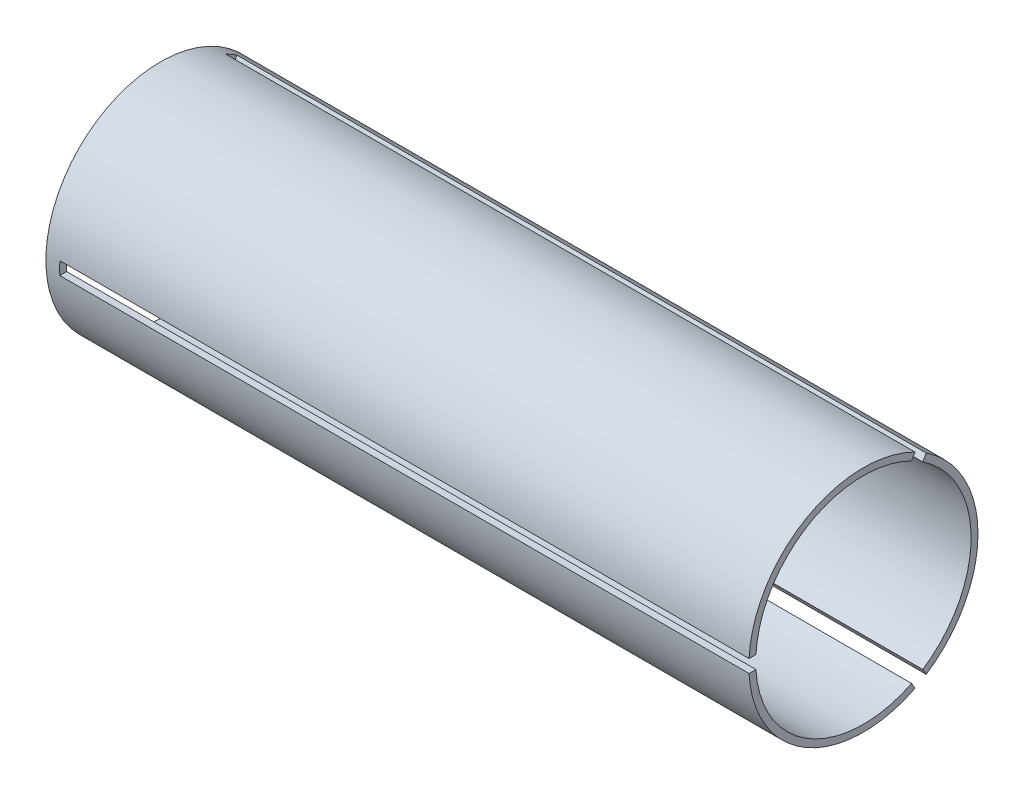
ISO-10303-21;
HEADER;
FILE_DESCRIPTION(('STEP AP214'),'2;1');
FILE_NAME('part.step','',(''),(''),'','','');
FILE_SCHEMA(('AUTOMOTIVE_DESIGN { 1 0 10303 214 1 1 1 1 }'));
ENDSEC;
DATA;
#1=APPLICATION_CONTEXT('core data for automotive mechanical design processes');
#2=APPLICATION_PROTOCOL_DEFINITION('international standard','automotive_design',2000,#1);
#3=PRODUCT_CONTEXT('',#1,'mechanical');
#4=PRODUCT('Part','Part','',(#3));
#5=PRODUCT_RELATED_PRODUCT_CATEGORY('part','',(#4));
#6=PRODUCT_DEFINITION_FORMATION('','',#4);
#7=PRODUCT_DEFINITION_CONTEXT('part definition',#1,'design');
#8=PRODUCT_DEFINITION('design','',#6,#7);
#9=PRODUCT_DEFINITION_SHAPE('','',#8);
#10=(LENGTH_UNIT() NAMED_UNIT(*) SI_UNIT(.MILLI.,.METRE.));
#11=(NAMED_UNIT(*) PLANE_ANGLE_UNIT() SI_UNIT($,.RADIAN.));
#12=(NAMED_UNIT(*) SI_UNIT($,.STERADIAN.) SOLID_ANGLE_UNIT());
#13=UNCERTAINTY_MEASURE_WITH_UNIT(LENGTH_MEASURE(1.E-05),#10,'distance_accuracy_value','');
#14=(GEOMETRIC_REPRESENTATION_CONTEXT(3) GLOBAL_UNCERTAINTY_ASSIGNED_CONTEXT((#13)) GLOBAL_UNIT_ASSIGNED_CONTEXT((#10,
#11,#12)) REPRESENTATION_CONTEXT('',''));
#15=CARTESIAN_POINT('',(0.,0.,0.));
#16=DIRECTION('',(0.,0.,1.));
#17=DIRECTION('',(1.,0.,0.));
#18=AXIS2_PLACEMENT_3D('',#15,#16,#17);
#19=CARTESIAN_POINT('',(259.08,0.,0.));
#20=DIRECTION('',(1.,0.,0.));
#21=DIRECTION('',(0.,0.,-1.));
#22=AXIS2_PLACEMENT_3D('',#19,#20,#21);
#23=PLANE('',#22);
#24=CARTESIAN_POINT('',(259.08,0.,0.));
#25=DIRECTION('',(1.,0.,0.));
#26=DIRECTION('',(0.,0.,-1.));
#27=AXIS2_PLACEMENT_3D('',#24,#25,#26);
#28=CIRCLE('',#27,39.6875);
#29=CARTESIAN_POINT('',(259.08,-33.117835742441,-21.870222037892));
#30=VERTEX_POINT('',#29);
#31=CARTESIAN_POINT('',(259.08,33.1178357424414,-21.8702220378915));
#32=VERTEX_POINT('',#31);
#33=EDGE_CURVE('E261',#30,#32,#28,.T.);
#34=ORIENTED_EDGE('',*,*,#33,.F.);
#35=DIRECTION('',(0.,0.866025403784436,0.500000000000004));
#36=VECTOR('',#35,1.);
#37=CARTESIAN_POINT('',(259.08,-48.7650438691536,-30.9041418619156));
#38=LINE('',#37,#36);
#39=CARTESIAN_POINT('',(259.08,-35.3212710547876,-23.1423760086172));
#40=VERTEX_POINT('',#39);
#41=EDGE_CURVE('E222',#40,#30,#38,.T.);
#42=ORIENTED_EDGE('',*,*,#41,.F.);
#43=CARTESIAN_POINT('',(259.08,0.,0.));
#44=DIRECTION('',(1.,0.,0.));
#45=DIRECTION('',(0.,0.,-1.));
#46=AXIS2_PLACEMENT_3D('',#43,#44,#45);
#47=CIRCLE('',#46,42.2275);
#48=CARTESIAN_POINT('',(259.08,35.321271054788,-23.1423760086167));
#49=VERTEX_POINT('',#48);
#50=EDGE_CURVE('E160',#40,#49,#47,.T.);
#51=ORIENTED_EDGE('',*,*,#50,.T.);
#52=DIRECTION('',(0.,-0.866025403784443,0.499999999999992));
#53=VECTOR('',#52,1.);
#54=CARTESIAN_POINT('',(259.08,48.7650438691539,-30.9041418619149));
#55=LINE('',#54,#53);
#56=EDGE_CURVE('E153',#49,#32,#55,.T.);
#57=ORIENTED_EDGE('',*,*,#56,.T.);
#58=EDGE_LOOP('',(#34,#42,#51,#57));
#59=FACE_BOUND('',#58,.T.);
#60=ADVANCED_FACE('F45',(#59),#23,.T.);
#61=CARTESIAN_POINT('',(259.08,-2.38125,42.1603060317107));
#62=VERTEX_POINT('',#61);
#63=CARTESIAN_POINT('',(259.08,-37.7025210547877,-19.0179300230938));
#64=VERTEX_POINT('',#63);
#65=EDGE_CURVE('E163',#62,#64,#47,.T.);
#66=ORIENTED_EDGE('',*,*,#65,.T.);
#67=DIRECTION('',(0.,0.866025403784436,0.500000000000004));
#68=VECTOR('',#67,1.);
#69=CARTESIAN_POINT('',(259.08,-51.1462938691536,-26.7796958763923));
#70=LINE('',#69,#68);
#71=CARTESIAN_POINT('',(259.08,-35.4990857424411,-17.7457760523686));
#72=VERTEX_POINT('',#71);
#73=EDGE_CURVE('E284',#64,#72,#70,.T.);
#74=ORIENTED_EDGE('',*,*,#73,.T.);
#75=CARTESIAN_POINT('',(259.08,-2.38125,39.6159980902602));
#76=VERTEX_POINT('',#75);
#77=EDGE_CURVE('E168',#76,#72,#28,.T.);
#78=ORIENTED_EDGE('',*,*,#77,.F.);
#79=DIRECTION('',(0.,0.,-1.));
#80=VECTOR('',#79,1.);
#81=CARTESIAN_POINT('',(259.08,-2.38125,42.2275));
#82=LINE('',#81,#80);
#83=EDGE_CURVE('E240',#62,#76,#82,.T.);
#84=ORIENTED_EDGE('',*,*,#83,.F.);
#85=EDGE_LOOP('',(#66,#74,#78,#84));
#86=FACE_BOUND('',#85,.T.);
#87=ADVANCED_FACE('F305',(#86),#23,.T.);
#88=CARTESIAN_POINT('',(259.08,35.4990857424413,-17.7457760523681));
#89=VERTEX_POINT('',#88);
#90=CARTESIAN_POINT('',(259.08,2.38125,39.6159980902602));
#91=VERTEX_POINT('',#90);
#92=EDGE_CURVE('E151',#89,#91,#28,.T.);
#93=ORIENTED_EDGE('',*,*,#92,.F.);
#94=DIRECTION('',(0.,-0.866025403784443,0.499999999999992));
#95=VECTOR('',#94,1.);
#96=CARTESIAN_POINT('',(259.08,51.1462938691538,-26.7796958763914));
#97=LINE('',#96,#95);
#98=CARTESIAN_POINT('',(259.08,37.7025210547879,-19.0179300230933));
#99=VERTEX_POINT('',#98);
#100=EDGE_CURVE('E69',#99,#89,#97,.T.);
#101=ORIENTED_EDGE('',*,*,#100,.F.);
#102=CARTESIAN_POINT('',(259.08,2.38125,42.1603060317107));
#103=VERTEX_POINT('',#102);
#104=EDGE_CURVE('E149',#99,#103,#47,.T.);
#105=ORIENTED_EDGE('',*,*,#104,.T.);
#106=DIRECTION('',(0.,0.,-1.));
#107=VECTOR('',#106,1.);
#108=CARTESIAN_POINT('',(259.08,2.38125,42.2275));
#109=LINE('',#108,#107);
#110=EDGE_CURVE('E237',#103,#91,#109,.T.);
#111=ORIENTED_EDGE('',*,*,#110,.T.);
#112=EDGE_LOOP('',(#93,#101,#105,#111));
#113=FACE_BOUND('',#112,.T.);
#114=ADVANCED_FACE('F147',(#113),#23,.T.);
#115=CARTESIAN_POINT('',(259.08,0.,0.));
#116=DIRECTION('',(-1.,0.,0.));
#117=DIRECTION('',(0.,0.,1.));
#118=AXIS2_PLACEMENT_3D('',#115,#116,#117);
#119=CYLINDRICAL_SURFACE('',#118,42.2275);
#120=CARTESIAN_POINT('',(0.,0.,0.));
#121=DIRECTION('',(1.,0.,0.));
#122=DIRECTION('',(0.,0.,-1.));
#123=AXIS2_PLACEMENT_3D('',#120,#121,#122);
#124=CIRCLE('',#123,42.2275);
#125=CARTESIAN_POINT('',(0.,0.,-42.2275));
#126=VERTEX_POINT('',#125);
#127=EDGE_CURVE('E161',#126,#126,#124,.T.);
#128=ORIENTED_EDGE('',*,*,#127,.T.);
#129=EDGE_LOOP('',(#128));
#130=FACE_BOUND('',#129,.T.);
#131=DIRECTION('',(-1.,0.,0.));
#132=VECTOR('',#131,1.);
#133=CARTESIAN_POINT('',(259.08,-35.3212710547876,-23.1423760086172));
#134=LINE('',#133,#132);
#135=CARTESIAN_POINT('',(5.07999999999997,-35.3212710547876,-23.1423760086172));
#136=VERTEX_POINT('',#135);
#137=EDGE_CURVE('E234',#136,#40,#134,.F.);
#138=ORIENTED_EDGE('',*,*,#137,.F.);
#139=CARTESIAN_POINT('',(5.07999999999997,0.,0.));
#140=DIRECTION('',(1.,0.,0.));
#141=DIRECTION('',(0.,0.,-1.));
#142=AXIS2_PLACEMENT_3D('',#139,#140,#141);
#143=CIRCLE('',#142,42.2275);
#144=CARTESIAN_POINT('',(5.07999999999997,-37.7025210547876,-19.0179300230939));
#145=VERTEX_POINT('',#144);
#146=EDGE_CURVE('E228',#145,#136,#143,.T.);
#147=ORIENTED_EDGE('',*,*,#146,.F.);
#148=DIRECTION('',(-1.,0.,0.));
#149=VECTOR('',#148,1.);
#150=CARTESIAN_POINT('',(259.08,-37.7025210547877,-19.0179300230938));
#151=LINE('',#150,#149);
#152=EDGE_CURVE('E218',#64,#145,#151,.T.);
#153=ORIENTED_EDGE('',*,*,#152,.F.);
#154=ORIENTED_EDGE('',*,*,#65,.F.);
#155=DIRECTION('',(-1.,0.,0.));
#156=VECTOR('',#155,1.);
#157=CARTESIAN_POINT('',(259.08,-2.38125,42.1603060317107));
#158=LINE('',#157,#156);
#159=CARTESIAN_POINT('',(5.07999999999997,-2.38125000000003,42.1603060317107));
#160=VERTEX_POINT('',#159);
#161=EDGE_CURVE('E251',#160,#62,#158,.F.);
#162=ORIENTED_EDGE('',*,*,#161,.F.);
#163=CARTESIAN_POINT('',(5.07999999999997,0.,0.));
#164=DIRECTION('',(1.,0.,0.));
#165=DIRECTION('',(0.,0.,-1.));
#166=AXIS2_PLACEMENT_3D('',#163,#164,#165);
#167=CIRCLE('',#166,42.2275);
#168=CARTESIAN_POINT('',(5.07999999999997,2.38124999999997,42.1603060317107));
#169=VERTEX_POINT('',#168);
#170=EDGE_CURVE('E254',#169,#160,#167,.T.);
#171=ORIENTED_EDGE('',*,*,#170,.F.);
#172=DIRECTION('',(-1.,0.,0.));
#173=VECTOR('',#172,1.);
#174=CARTESIAN_POINT('',(259.08,2.38125,42.1603060317107));
#175=LINE('',#174,#173);
#176=EDGE_CURVE('E158',#103,#169,#175,.T.);
#177=ORIENTED_EDGE('',*,*,#176,.F.);
#178=ORIENTED_EDGE('',*,*,#104,.F.);
#179=DIRECTION('',(-1.,0.,0.));
#180=VECTOR('',#179,1.);
#181=CARTESIAN_POINT('',(259.08,37.7025210547879,-19.0179300230933));
#182=LINE('',#181,#180);
#183=CARTESIAN_POINT('',(5.07999999999997,37.7025210547879,-19.0179300230933));
#184=VERTEX_POINT('',#183);
#185=EDGE_CURVE('E134',#184,#99,#182,.F.);
#186=ORIENTED_EDGE('',*,*,#185,.F.);
#187=CARTESIAN_POINT('',(5.07999999999997,35.321271054788,-23.1423760086167));
#188=VERTEX_POINT('',#187);
#189=EDGE_CURVE('E231',#188,#184,#143,.T.);
#190=ORIENTED_EDGE('',*,*,#189,.F.);
#191=DIRECTION('',(-1.,0.,0.));
#192=VECTOR('',#191,1.);
#193=CARTESIAN_POINT('',(259.08,35.321271054788,-23.1423760086167));
#194=LINE('',#193,#192);
#195=EDGE_CURVE('E142',#49,#188,#194,.T.);
#196=ORIENTED_EDGE('',*,*,#195,.F.);
#197=ORIENTED_EDGE('',*,*,#50,.F.);
#198=EDGE_LOOP('',(#138,#147,#153,#154,#162,#171,#177,#178,#186,#190,#196,#197));
#199=FACE_BOUND('',#198,.T.);
#200=ADVANCED_FACE('F47',(#130,#199),#119,.T.);
#201=CARTESIAN_POINT('',(259.08,0.,0.));
#202=DIRECTION('',(-1.,0.,0.));
#203=DIRECTION('',(0.,0.,1.));
#204=AXIS2_PLACEMENT_3D('',#201,#202,#203);
#205=CYLINDRICAL_SURFACE('',#204,39.6875);
#206=CARTESIAN_POINT('',(0.,0.,0.));
#207=DIRECTION('',(1.,0.,0.));
#208=DIRECTION('',(0.,0.,-1.));
#209=AXIS2_PLACEMENT_3D('',#206,#207,#208);
#210=CIRCLE('',#209,39.6875);
#211=CARTESIAN_POINT('',(0.,0.,-39.6875));
#212=VERTEX_POINT('',#211);
#213=EDGE_CURVE('E259',#212,#212,#210,.T.);
#214=ORIENTED_EDGE('',*,*,#213,.F.);
#215=EDGE_LOOP('',(#214));
#216=FACE_BOUND('',#215,.T.);
#217=CARTESIAN_POINT('',(5.07999999999997,0.,0.));
#218=DIRECTION('',(1.,0.,0.));
#219=DIRECTION('',(0.,0.,-1.));
#220=AXIS2_PLACEMENT_3D('',#217,#218,#219);
#221=CIRCLE('',#220,39.6875);
#222=CARTESIAN_POINT('',(5.07999999999997,-35.499085742441,-17.7457760523686));
#223=VERTEX_POINT('',#222);
#224=CARTESIAN_POINT('',(5.07999999999997,-33.117835742441,-21.870222037892));
#225=VERTEX_POINT('',#224);
#226=EDGE_CURVE('E201',#223,#225,#221,.T.);
#227=ORIENTED_EDGE('',*,*,#226,.T.);
#228=DIRECTION('',(-1.,0.,0.));
#229=VECTOR('',#228,1.);
#230=CARTESIAN_POINT('',(259.08,-33.117835742441,-21.870222037892));
#231=LINE('',#230,#229);
#232=EDGE_CURVE('E11',#225,#30,#231,.F.);
#233=ORIENTED_EDGE('',*,*,#232,.T.);
#234=ORIENTED_EDGE('',*,*,#33,.T.);
#235=DIRECTION('',(-1.,0.,0.));
#236=VECTOR('',#235,1.);
#237=CARTESIAN_POINT('',(259.08,33.1178357424414,-21.8702220378915));
#238=LINE('',#237,#236);
#239=CARTESIAN_POINT('',(5.07999999999997,33.1178357424414,-21.8702220378915));
#240=VERTEX_POINT('',#239);
#241=EDGE_CURVE('E200',#32,#240,#238,.T.);
#242=ORIENTED_EDGE('',*,*,#241,.T.);
#243=CARTESIAN_POINT('',(5.07999999999997,35.4990857424413,-17.745776052368));
#244=VERTEX_POINT('',#243);
#245=EDGE_CURVE('E196',#240,#244,#221,.T.);
#246=ORIENTED_EDGE('',*,*,#245,.T.);
#247=DIRECTION('',(-1.,0.,0.));
#248=VECTOR('',#247,1.);
#249=CARTESIAN_POINT('',(259.08,35.4990857424413,-17.7457760523681));
#250=LINE('',#249,#248);
#251=EDGE_CURVE('E193',#244,#89,#250,.F.);
#252=ORIENTED_EDGE('',*,*,#251,.T.);
#253=ORIENTED_EDGE('',*,*,#92,.T.);
#254=DIRECTION('',(-1.,0.,0.));
#255=VECTOR('',#254,1.);
#256=CARTESIAN_POINT('',(259.08,2.38125,39.6159980902602));
#257=LINE('',#256,#255);
#258=CARTESIAN_POINT('',(5.07999999999997,2.38124999999997,39.6159980902602));
#259=VERTEX_POINT('',#258);
#260=EDGE_CURVE('E187',#91,#259,#257,.T.);
#261=ORIENTED_EDGE('',*,*,#260,.T.);
#262=CARTESIAN_POINT('',(5.07999999999997,0.,0.));
#263=DIRECTION('',(1.,0.,0.));
#264=DIRECTION('',(0.,0.,-1.));
#265=AXIS2_PLACEMENT_3D('',#262,#263,#264);
#266=CIRCLE('',#265,39.6875);
#267=CARTESIAN_POINT('',(5.07999999999997,-2.38125000000003,39.6159980902602));
#268=VERTEX_POINT('',#267);
#269=EDGE_CURVE('E180',#259,#268,#266,.T.);
#270=ORIENTED_EDGE('',*,*,#269,.T.);
#271=DIRECTION('',(-1.,0.,0.));
#272=VECTOR('',#271,1.);
#273=CARTESIAN_POINT('',(259.08,-2.38125,39.6159980902602));
#274=LINE('',#273,#272);
#275=EDGE_CURVE('E173',#268,#76,#274,.F.);
#276=ORIENTED_EDGE('',*,*,#275,.T.);
#277=ORIENTED_EDGE('',*,*,#77,.T.);
#278=DIRECTION('',(-1.,0.,0.));
#279=VECTOR('',#278,1.);
#280=CARTESIAN_POINT('',(259.08,-35.4990857424411,-17.7457760523686));
#281=LINE('',#280,#279);
#282=EDGE_CURVE('E54',#72,#223,#281,.T.);
#283=ORIENTED_EDGE('',*,*,#282,.T.);
#284=EDGE_LOOP('',(#227,#233,#234,#242,#246,#252,#253,#261,#270,#276,#277,#283));
#285=FACE_BOUND('',#284,.T.);
#286=ADVANCED_FACE('F208',(#216,#285),#205,.F.);
#287=CARTESIAN_POINT('',(0.,0.,0.));
#288=DIRECTION('',(1.,0.,0.));
#289=DIRECTION('',(0.,0.,-1.));
#290=AXIS2_PLACEMENT_3D('',#287,#288,#289);
#291=PLANE('',#290);
#292=ORIENTED_EDGE('',*,*,#127,.F.);
#293=EDGE_LOOP('',(#292));
#294=FACE_BOUND('',#293,.T.);
#295=ORIENTED_EDGE('',*,*,#213,.T.);
#296=EDGE_LOOP('',(#295));
#297=FACE_BOUND('',#296,.T.);
#298=ADVANCED_FACE('F320',(#294,#297),#291,.F.);
#299=CARTESIAN_POINT('',(5.07999999999997,2.38124999999997,42.2275));
#300=DIRECTION('',(0.,-1.,0.));
#301=DIRECTION('',(1.,0.,0.));
#302=AXIS2_PLACEMENT_3D('',#299,#300,#301);
#303=PLANE('',#302);
#304=ORIENTED_EDGE('',*,*,#176,.T.);
#305=DIRECTION('',(0.,0.,-1.));
#306=VECTOR('',#305,1.);
#307=CARTESIAN_POINT('',(5.07999999999997,2.38124999999997,42.2275));
#308=LINE('',#307,#306);
#309=EDGE_CURVE('E247',#169,#259,#308,.T.);
#310=ORIENTED_EDGE('',*,*,#309,.T.);
#311=ORIENTED_EDGE('',*,*,#260,.F.);
#312=ORIENTED_EDGE('',*,*,#110,.F.);
#313=EDGE_LOOP('',(#304,#310,#311,#312));
#314=FACE_BOUND('',#313,.T.);
#315=ADVANCED_FACE('F325',(#314),#303,.T.);
#316=CARTESIAN_POINT('',(5.07999999999997,-2.38125000000003,42.2275));
#317=DIRECTION('',(1.,0.,0.));
#318=DIRECTION('',(0.,0.,-1.));
#319=AXIS2_PLACEMENT_3D('',#316,#317,#318);
#320=PLANE('',#319);
#321=ORIENTED_EDGE('',*,*,#170,.T.);
#322=DIRECTION('',(0.,0.,-1.));
#323=VECTOR('',#322,1.);
#324=CARTESIAN_POINT('',(5.07999999999997,-2.38125000000003,42.2275));
#325=LINE('',#324,#323);
#326=EDGE_CURVE('E243',#160,#268,#325,.T.);
#327=ORIENTED_EDGE('',*,*,#326,.T.);
#328=ORIENTED_EDGE('',*,*,#269,.F.);
#329=ORIENTED_EDGE('',*,*,#309,.F.);
#330=EDGE_LOOP('',(#321,#327,#328,#329));
#331=FACE_BOUND('',#330,.T.);
#332=ADVANCED_FACE('F329',(#331),#320,.T.);
#333=CARTESIAN_POINT('',(5.07999999999997,-2.38125000000003,42.2275));
#334=DIRECTION('',(0.,1.,0.));
#335=DIRECTION('',(-1.,0.,0.));
#336=AXIS2_PLACEMENT_3D('',#333,#334,#335);
#337=PLANE('',#336);
#338=ORIENTED_EDGE('',*,*,#161,.T.);
#339=ORIENTED_EDGE('',*,*,#83,.T.);
#340=ORIENTED_EDGE('',*,*,#275,.F.);
#341=ORIENTED_EDGE('',*,*,#326,.F.);
#342=EDGE_LOOP('',(#338,#339,#340,#341));
#343=FACE_BOUND('',#342,.T.);
#344=ADVANCED_FACE('F335',(#343),#337,.T.);
#345=CARTESIAN_POINT('',(5.07999999999997,51.1462938691538,-26.7796958763914));
#346=DIRECTION('',(0.,-0.499999999999992,-0.866025403784443));
#347=DIRECTION('',(0.,0.866025403784443,-0.499999999999992));
#348=AXIS2_PLACEMENT_3D('',#345,#346,#347);
#349=PLANE('',#348);
#350=ORIENTED_EDGE('',*,*,#185,.T.);
#351=ORIENTED_EDGE('',*,*,#100,.T.);
#352=ORIENTED_EDGE('',*,*,#251,.F.);
#353=DIRECTION('',(0.,-0.866025403784443,0.499999999999992));
#354=VECTOR('',#353,1.);
#355=CARTESIAN_POINT('',(5.07999999999997,51.1462938691538,-26.7796958763914));
#356=LINE('',#355,#354);
#357=EDGE_CURVE('E137',#184,#244,#356,.T.);
#358=ORIENTED_EDGE('',*,*,#357,.F.);
#359=EDGE_LOOP('',(#350,#351,#352,#358));
#360=FACE_BOUND('',#359,.T.);
#361=ADVANCED_FACE('F135',(#360),#349,.T.);
#362=CARTESIAN_POINT('',(5.07999999999997,48.7650438691539,-30.9041418619148));
#363=DIRECTION('',(0.,0.499999999999992,0.866025403784443));
#364=DIRECTION('',(0.,-0.866025403784443,0.499999999999992));
#365=AXIS2_PLACEMENT_3D('',#362,#363,#364);
#366=PLANE('',#365);
#367=ORIENTED_EDGE('',*,*,#195,.T.);
#368=DIRECTION('',(0.,-0.866025403784443,0.499999999999992));
#369=VECTOR('',#368,1.);
#370=CARTESIAN_POINT('',(5.07999999999997,48.7650438691539,-30.9041418619148));
#371=LINE('',#370,#369);
#372=EDGE_CURVE('E280',#188,#240,#371,.T.);
#373=ORIENTED_EDGE('',*,*,#372,.T.);
#374=ORIENTED_EDGE('',*,*,#241,.F.);
#375=ORIENTED_EDGE('',*,*,#56,.F.);
#376=EDGE_LOOP('',(#367,#373,#374,#375));
#377=FACE_BOUND('',#376,.T.);
#378=ADVANCED_FACE('F290',(#377),#366,.T.);
#379=CARTESIAN_POINT('',(5.07999999999997,-48.7650438691536,-30.9041418619157));
#380=DIRECTION('',(1.,0.,0.));
#381=DIRECTION('',(0.,0.,-1.));
#382=AXIS2_PLACEMENT_3D('',#379,#380,#381);
#383=PLANE('',#382);
#384=ORIENTED_EDGE('',*,*,#189,.T.);
#385=ORIENTED_EDGE('',*,*,#357,.T.);
#386=ORIENTED_EDGE('',*,*,#245,.F.);
#387=ORIENTED_EDGE('',*,*,#372,.F.);
#388=EDGE_LOOP('',(#384,#385,#386,#387));
#389=FACE_BOUND('',#388,.T.);
#390=ADVANCED_FACE('F292',(#389),#383,.T.);
#391=CARTESIAN_POINT('',(5.07999999999997,-48.7650438691536,-30.9041418619157));
#392=DIRECTION('',(0.,-0.500000000000004,0.866025403784436));
#393=DIRECTION('',(0.,-0.866025403784436,-0.500000000000004));
#394=AXIS2_PLACEMENT_3D('',#391,#392,#393);
#395=PLANE('',#394);
#396=ORIENTED_EDGE('',*,*,#137,.T.);
#397=ORIENTED_EDGE('',*,*,#41,.T.);
#398=ORIENTED_EDGE('',*,*,#232,.F.);
#399=DIRECTION('',(0.,0.866025403784436,0.500000000000004));
#400=VECTOR('',#399,1.);
#401=CARTESIAN_POINT('',(5.07999999999997,-48.7650438691536,-30.9041418619157));
#402=LINE('',#401,#400);
#403=EDGE_CURVE('E61',#136,#225,#402,.T.);
#404=ORIENTED_EDGE('',*,*,#403,.F.);
#405=EDGE_LOOP('',(#396,#397,#398,#404));
#406=FACE_BOUND('',#405,.T.);
#407=ADVANCED_FACE('F288',(#406),#395,.T.);
#408=CARTESIAN_POINT('',(5.07999999999997,-51.1462938691536,-26.7796958763923));
#409=DIRECTION('',(0.,0.500000000000004,-0.866025403784436));
#410=DIRECTION('',(0.,0.866025403784436,0.500000000000004));
#411=AXIS2_PLACEMENT_3D('',#408,#409,#410);
#412=PLANE('',#411);
#413=ORIENTED_EDGE('',*,*,#152,.T.);
#414=DIRECTION('',(0.,0.866025403784436,0.500000000000004));
#415=VECTOR('',#414,1.);
#416=CARTESIAN_POINT('',(5.07999999999997,-51.1462938691536,-26.7796958763923));
#417=LINE('',#416,#415);
#418=EDGE_CURVE('E143',#145,#223,#417,.T.);
#419=ORIENTED_EDGE('',*,*,#418,.T.);
#420=ORIENTED_EDGE('',*,*,#282,.F.);
#421=ORIENTED_EDGE('',*,*,#73,.F.);
#422=EDGE_LOOP('',(#413,#419,#420,#421));
#423=FACE_BOUND('',#422,.T.);
#424=ADVANCED_FACE('F216',(#423),#412,.T.);
#425=ORIENTED_EDGE('',*,*,#146,.T.);
#426=ORIENTED_EDGE('',*,*,#403,.T.);
#427=ORIENTED_EDGE('',*,*,#226,.F.);
#428=ORIENTED_EDGE('',*,*,#418,.F.);
#429=EDGE_LOOP('',(#425,#426,#427,#428));
#430=FACE_BOUND('',#429,.T.);
#431=ADVANCED_FACE('F213',(#430),#383,.T.);
#432=CLOSED_SHELL('',(#60,#87,#114,#200,#286,#298,#315,#332,#344,#361,#378,#390,#407,#424,#431));
#433=MANIFOLD_SOLID_BREP('B2',#432);
#434=ADVANCED_BREP_SHAPE_REPRESENTATION('',(#18,#433),#14);
#435=SHAPE_DEFINITION_REPRESENTATION(#9,#434);
ENDSEC;
END-ISO-10303-21;
